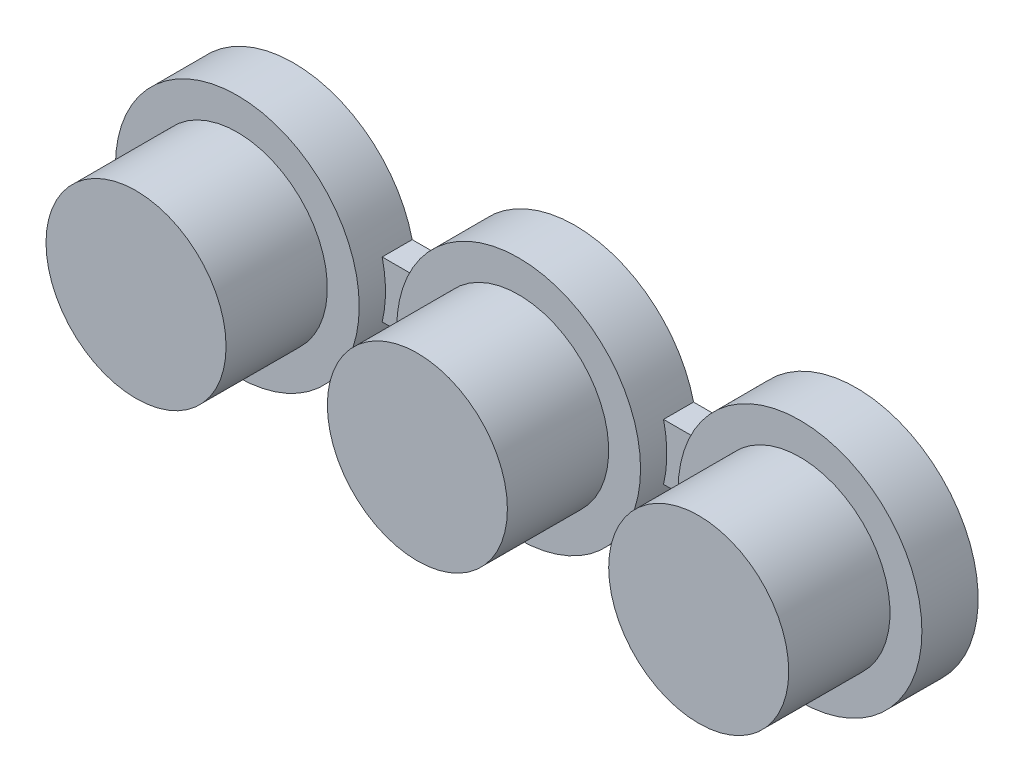
ISO-10303-21;
HEADER;
FILE_DESCRIPTION(('STEP AP214'),'2;1');
FILE_NAME('part.step','',(''),(''),'','','');
FILE_SCHEMA(('AUTOMOTIVE_DESIGN { 1 0 10303 214 1 1 1 1 }'));
ENDSEC;
DATA;
#1=APPLICATION_CONTEXT('core data for automotive mechanical design processes');
#2=APPLICATION_PROTOCOL_DEFINITION('international standard','automotive_design',2000,#1);
#3=PRODUCT_CONTEXT('',#1,'mechanical');
#4=PRODUCT('Part','Part','',(#3));
#5=PRODUCT_RELATED_PRODUCT_CATEGORY('part','',(#4));
#6=PRODUCT_DEFINITION_FORMATION('','',#4);
#7=PRODUCT_DEFINITION_CONTEXT('part definition',#1,'design');
#8=PRODUCT_DEFINITION('design','',#6,#7);
#9=PRODUCT_DEFINITION_SHAPE('','',#8);
#10=(LENGTH_UNIT() NAMED_UNIT(*) SI_UNIT(.MILLI.,.METRE.));
#11=(NAMED_UNIT(*) PLANE_ANGLE_UNIT() SI_UNIT($,.RADIAN.));
#12=(NAMED_UNIT(*) SI_UNIT($,.STERADIAN.) SOLID_ANGLE_UNIT());
#13=UNCERTAINTY_MEASURE_WITH_UNIT(LENGTH_MEASURE(1.E-05),#10,'distance_accuracy_value','');
#14=(GEOMETRIC_REPRESENTATION_CONTEXT(3) GLOBAL_UNCERTAINTY_ASSIGNED_CONTEXT((#13)) GLOBAL_UNIT_ASSIGNED_CONTEXT((#10,
#11,#12)) REPRESENTATION_CONTEXT('',''));
#15=CARTESIAN_POINT('',(0.,0.,0.));
#16=DIRECTION('',(0.,0.,1.));
#17=DIRECTION('',(1.,0.,0.));
#18=AXIS2_PLACEMENT_3D('',#15,#16,#17);
#19=CARTESIAN_POINT('',(-7.3315927665374,0.750000000000001,0.8));
#20=DIRECTION('',(0.,1.,0.));
#21=DIRECTION('',(-1.,0.,0.));
#22=AXIS2_PLACEMENT_3D('',#19,#20,#21);
#23=PLANE('',#22);
#24=DIRECTION('',(0.,0.,-1.));
#25=VECTOR('',#24,1.);
#26=CARTESIAN_POINT('',(4.33772233983162,0.749999999999999,1.5));
#27=LINE('',#26,#25);
#28=CARTESIAN_POINT('',(4.33772233983162,0.749999999999999,0.));
#29=VERTEX_POINT('',#28);
#30=CARTESIAN_POINT('',(4.33772233983162,0.749999999999999,0.8));
#31=VERTEX_POINT('',#30);
#32=EDGE_CURVE('E267',#29,#31,#27,.F.);
#33=ORIENTED_EDGE('',*,*,#32,.F.);
#34=DIRECTION('',(1.,0.,0.));
#35=VECTOR('',#34,1.);
#36=CARTESIAN_POINT('',(-7.3315927665374,0.750000000000001,0.));
#37=LINE('',#36,#35);
#38=CARTESIAN_POINT('',(3.16227766016838,0.749999999999999,0.));
#39=VERTEX_POINT('',#38);
#40=EDGE_CURVE('E143',#39,#29,#37,.T.);
#41=ORIENTED_EDGE('',*,*,#40,.F.);
#42=DIRECTION('',(0.,0.,-1.));
#43=VECTOR('',#42,1.);
#44=CARTESIAN_POINT('',(3.16227766016838,0.749999999999999,1.5));
#45=LINE('',#44,#43);
#46=CARTESIAN_POINT('',(3.16227766016838,0.749999999999999,0.8));
#47=VERTEX_POINT('',#46);
#48=EDGE_CURVE('E297',#47,#39,#45,.T.);
#49=ORIENTED_EDGE('',*,*,#48,.F.);
#50=DIRECTION('',(1.,0.,0.));
#51=VECTOR('',#50,1.);
#52=CARTESIAN_POINT('',(-7.3315927665374,0.750000000000001,0.8));
#53=LINE('',#52,#51);
#54=EDGE_CURVE('E309',#47,#31,#53,.T.);
#55=ORIENTED_EDGE('',*,*,#54,.T.);
#56=EDGE_LOOP('',(#33,#41,#49,#55));
#57=FACE_BOUND('',#56,.T.);
#58=ADVANCED_FACE('F45',(#57),#23,.T.);
#59=CARTESIAN_POINT('',(-7.3315927665374,-0.749999999999999,0.8));
#60=DIRECTION('',(0.,-1.,0.));
#61=DIRECTION('',(1.,0.,0.));
#62=AXIS2_PLACEMENT_3D('',#59,#60,#61);
#63=PLANE('',#62);
#64=DIRECTION('',(0.,0.,-1.));
#65=VECTOR('',#64,1.);
#66=CARTESIAN_POINT('',(4.33772233983162,-0.75,1.5));
#67=LINE('',#66,#65);
#68=CARTESIAN_POINT('',(4.33772233983162,-0.75,0.8));
#69=VERTEX_POINT('',#68);
#70=CARTESIAN_POINT('',(4.33772233983162,-0.75,0.));
#71=VERTEX_POINT('',#70);
#72=EDGE_CURVE('E61',#69,#71,#67,.T.);
#73=ORIENTED_EDGE('',*,*,#72,.F.);
#74=DIRECTION('',(-1.,0.,0.));
#75=VECTOR('',#74,1.);
#76=CARTESIAN_POINT('',(-7.3315927665374,-0.749999999999999,0.8));
#77=LINE('',#76,#75);
#78=CARTESIAN_POINT('',(3.16227766016838,-0.75,0.8));
#79=VERTEX_POINT('',#78);
#80=EDGE_CURVE('E148',#69,#79,#77,.T.);
#81=ORIENTED_EDGE('',*,*,#80,.T.);
#82=DIRECTION('',(0.,0.,-1.));
#83=VECTOR('',#82,1.);
#84=CARTESIAN_POINT('',(3.16227766016838,-0.75,1.5));
#85=LINE('',#84,#83);
#86=CARTESIAN_POINT('',(3.16227766016838,-0.75,0.));
#87=VERTEX_POINT('',#86);
#88=EDGE_CURVE('E293',#87,#79,#85,.F.);
#89=ORIENTED_EDGE('',*,*,#88,.F.);
#90=DIRECTION('',(-1.,0.,0.));
#91=VECTOR('',#90,1.);
#92=CARTESIAN_POINT('',(-7.3315927665374,-0.749999999999999,0.));
#93=LINE('',#92,#91);
#94=EDGE_CURVE('E150',#71,#87,#93,.T.);
#95=ORIENTED_EDGE('',*,*,#94,.F.);
#96=EDGE_LOOP('',(#73,#81,#89,#95));
#97=FACE_BOUND('',#96,.T.);
#98=ADVANCED_FACE('F190',(#97),#63,.T.);
#99=DIRECTION('',(0.,0.,-1.));
#100=VECTOR('',#99,1.);
#101=CARTESIAN_POINT('',(-4.33772233983162,0.75,1.5));
#102=LINE('',#101,#100);
#103=CARTESIAN_POINT('',(-4.33772233983162,0.75,0.8));
#104=VERTEX_POINT('',#103);
#105=CARTESIAN_POINT('',(-4.33772233983162,0.75,0.));
#106=VERTEX_POINT('',#105);
#107=EDGE_CURVE('E111',#104,#106,#102,.T.);
#108=ORIENTED_EDGE('',*,*,#107,.F.);
#109=CARTESIAN_POINT('',(-3.16227766016838,0.75,0.8));
#110=VERTEX_POINT('',#109);
#111=EDGE_CURVE('E159',#104,#110,#53,.T.);
#112=ORIENTED_EDGE('',*,*,#111,.T.);
#113=DIRECTION('',(0.,0.,-1.));
#114=VECTOR('',#113,1.);
#115=CARTESIAN_POINT('',(-3.16227766016838,0.75,1.5));
#116=LINE('',#115,#114);
#117=CARTESIAN_POINT('',(-3.16227766016838,0.75,0.));
#118=VERTEX_POINT('',#117);
#119=EDGE_CURVE('E139',#118,#110,#116,.F.);
#120=ORIENTED_EDGE('',*,*,#119,.F.);
#121=EDGE_CURVE('E130',#106,#118,#37,.T.);
#122=ORIENTED_EDGE('',*,*,#121,.F.);
#123=EDGE_LOOP('',(#108,#112,#120,#122));
#124=FACE_BOUND('',#123,.T.);
#125=ADVANCED_FACE('F137',(#124),#23,.T.);
#126=DIRECTION('',(0.,0.,-1.));
#127=VECTOR('',#126,1.);
#128=CARTESIAN_POINT('',(-4.33772233983162,-0.749999999999999,1.5));
#129=LINE('',#128,#127);
#130=CARTESIAN_POINT('',(-4.33772233983162,-0.749999999999999,0.));
#131=VERTEX_POINT('',#130);
#132=CARTESIAN_POINT('',(-4.33772233983162,-0.749999999999999,0.8));
#133=VERTEX_POINT('',#132);
#134=EDGE_CURVE('E123',#131,#133,#129,.F.);
#135=ORIENTED_EDGE('',*,*,#134,.F.);
#136=CARTESIAN_POINT('',(-3.16227766016838,-0.749999999999999,0.));
#137=VERTEX_POINT('',#136);
#138=EDGE_CURVE('E133',#137,#131,#93,.T.);
#139=ORIENTED_EDGE('',*,*,#138,.F.);
#140=DIRECTION('',(0.,0.,-1.));
#141=VECTOR('',#140,1.);
#142=CARTESIAN_POINT('',(-3.16227766016838,-0.749999999999999,1.5));
#143=LINE('',#142,#141);
#144=CARTESIAN_POINT('',(-3.16227766016838,-0.749999999999999,0.8));
#145=VERTEX_POINT('',#144);
#146=EDGE_CURVE('E280',#145,#137,#143,.T.);
#147=ORIENTED_EDGE('',*,*,#146,.F.);
#148=EDGE_CURVE('E142',#145,#133,#77,.T.);
#149=ORIENTED_EDGE('',*,*,#148,.T.);
#150=EDGE_LOOP('',(#135,#139,#147,#149));
#151=FACE_BOUND('',#150,.T.);
#152=ADVANCED_FACE('F197',(#151),#63,.T.);
#153=CARTESIAN_POINT('',(0.,0.,0.8));
#154=DIRECTION('',(0.,0.,-1.));
#155=DIRECTION('',(-1.,0.,0.));
#156=AXIS2_PLACEMENT_3D('',#153,#154,#155);
#157=PLANE('',#156);
#158=ORIENTED_EDGE('',*,*,#80,.F.);
#159=CARTESIAN_POINT('',(7.5,0.,0.8));
#160=DIRECTION('',(0.,0.,-1.));
#161=DIRECTION('',(-1.,0.,0.));
#162=AXIS2_PLACEMENT_3D('',#159,#160,#161);
#163=CIRCLE('',#162,3.25);
#164=EDGE_CURVE('E68',#69,#31,#163,.T.);
#165=ORIENTED_EDGE('',*,*,#164,.T.);
#166=ORIENTED_EDGE('',*,*,#54,.F.);
#167=CARTESIAN_POINT('',(0.,0.,0.8));
#168=DIRECTION('',(0.,0.,-1.));
#169=DIRECTION('',(-1.,0.,0.));
#170=AXIS2_PLACEMENT_3D('',#167,#168,#169);
#171=CIRCLE('',#170,3.25);
#172=EDGE_CURVE('E289',#47,#79,#171,.T.);
#173=ORIENTED_EDGE('',*,*,#172,.T.);
#174=EDGE_LOOP('',(#158,#165,#166,#173));
#175=FACE_BOUND('',#174,.T.);
#176=ADVANCED_FACE('F203',(#175),#157,.F.);
#177=CARTESIAN_POINT('',(-7.5,0.,0.));
#178=DIRECTION('',(0.,0.,1.));
#179=DIRECTION('',(1.,0.,0.));
#180=AXIS2_PLACEMENT_3D('',#177,#178,#179);
#181=PLANE('',#180);
#182=ORIENTED_EDGE('',*,*,#40,.T.);
#183=CARTESIAN_POINT('',(7.5,0.,0.));
#184=DIRECTION('',(0.,0.,-1.));
#185=DIRECTION('',(-1.,0.,0.));
#186=AXIS2_PLACEMENT_3D('',#183,#184,#185);
#187=CIRCLE('',#186,3.25);
#188=EDGE_CURVE('E257',#29,#71,#187,.T.);
#189=ORIENTED_EDGE('',*,*,#188,.T.);
#190=ORIENTED_EDGE('',*,*,#94,.T.);
#191=CARTESIAN_POINT('',(0.,0.,0.));
#192=DIRECTION('',(0.,0.,-1.));
#193=DIRECTION('',(-1.,0.,0.));
#194=AXIS2_PLACEMENT_3D('',#191,#192,#193);
#195=CIRCLE('',#194,3.25);
#196=EDGE_CURVE('E122',#87,#137,#195,.T.);
#197=ORIENTED_EDGE('',*,*,#196,.T.);
#198=ORIENTED_EDGE('',*,*,#138,.T.);
#199=CARTESIAN_POINT('',(-7.5,0.,0.));
#200=DIRECTION('',(0.,0.,-1.));
#201=DIRECTION('',(-1.,0.,0.));
#202=AXIS2_PLACEMENT_3D('',#199,#200,#201);
#203=CIRCLE('',#202,3.25);
#204=EDGE_CURVE('E114',#131,#106,#203,.T.);
#205=ORIENTED_EDGE('',*,*,#204,.T.);
#206=ORIENTED_EDGE('',*,*,#121,.T.);
#207=EDGE_CURVE('E281',#118,#39,#195,.T.);
#208=ORIENTED_EDGE('',*,*,#207,.T.);
#209=EDGE_LOOP('',(#182,#189,#190,#197,#198,#205,#206,#208));
#210=FACE_BOUND('',#209,.T.);
#211=ADVANCED_FACE('F128',(#210),#181,.F.);
#212=ORIENTED_EDGE('',*,*,#111,.F.);
#213=CARTESIAN_POINT('',(-7.5,0.,0.8));
#214=DIRECTION('',(0.,0.,-1.));
#215=DIRECTION('',(-1.,0.,0.));
#216=AXIS2_PLACEMENT_3D('',#213,#214,#215);
#217=CIRCLE('',#216,3.25);
#218=EDGE_CURVE('E117',#104,#133,#217,.T.);
#219=ORIENTED_EDGE('',*,*,#218,.T.);
#220=ORIENTED_EDGE('',*,*,#148,.F.);
#221=CARTESIAN_POINT('',(0.,0.,0.8));
#222=DIRECTION('',(0.,0.,-1.));
#223=DIRECTION('',(-1.,0.,0.));
#224=AXIS2_PLACEMENT_3D('',#221,#222,#223);
#225=CIRCLE('',#224,3.25);
#226=EDGE_CURVE('E163',#145,#110,#225,.T.);
#227=ORIENTED_EDGE('',*,*,#226,.T.);
#228=EDGE_LOOP('',(#212,#219,#220,#227));
#229=FACE_BOUND('',#228,.T.);
#230=ADVANCED_FACE('F208',(#229),#157,.F.);
#231=CARTESIAN_POINT('',(0.,0.,1.5));
#232=DIRECTION('',(0.,0.,-1.));
#233=DIRECTION('',(-1.,0.,0.));
#234=AXIS2_PLACEMENT_3D('',#231,#232,#233);
#235=CYLINDRICAL_SURFACE('',#234,3.25);
#236=ORIENTED_EDGE('',*,*,#172,.F.);
#237=ORIENTED_EDGE('',*,*,#48,.T.);
#238=ORIENTED_EDGE('',*,*,#207,.F.);
#239=ORIENTED_EDGE('',*,*,#119,.T.);
#240=ORIENTED_EDGE('',*,*,#226,.F.);
#241=ORIENTED_EDGE('',*,*,#146,.T.);
#242=ORIENTED_EDGE('',*,*,#196,.F.);
#243=ORIENTED_EDGE('',*,*,#88,.T.);
#244=EDGE_LOOP('',(#236,#237,#238,#239,#240,#241,#242,#243));
#245=FACE_BOUND('',#244,.T.);
#246=CARTESIAN_POINT('',(0.,0.,1.5));
#247=DIRECTION('',(0.,0.,-1.));
#248=DIRECTION('',(-1.,0.,0.));
#249=AXIS2_PLACEMENT_3D('',#246,#247,#248);
#250=CIRCLE('',#249,3.25);
#251=CARTESIAN_POINT('',(-3.25,0.,1.5));
#252=VERTEX_POINT('',#251);
#253=EDGE_CURVE('E276',#252,#252,#250,.T.);
#254=ORIENTED_EDGE('',*,*,#253,.T.);
#255=EDGE_LOOP('',(#254));
#256=FACE_BOUND('',#255,.T.);
#257=ADVANCED_FACE('F213',(#245,#256),#235,.T.);
#258=CARTESIAN_POINT('',(0.,0.,1.5));
#259=DIRECTION('',(0.,0.,-1.));
#260=DIRECTION('',(-1.,0.,0.));
#261=AXIS2_PLACEMENT_3D('',#258,#259,#260);
#262=PLANE('',#261);
#263=CARTESIAN_POINT('',(0.,0.,1.5));
#264=DIRECTION('',(0.,0.,-1.));
#265=DIRECTION('',(-1.,0.,0.));
#266=AXIS2_PLACEMENT_3D('',#263,#264,#265);
#267=CIRCLE('',#266,2.4);
#268=CARTESIAN_POINT('',(-2.4,0.,1.5));
#269=VERTEX_POINT('',#268);
#270=EDGE_CURVE('E158',#269,#269,#267,.T.);
#271=ORIENTED_EDGE('',*,*,#270,.T.);
#272=EDGE_LOOP('',(#271));
#273=FACE_BOUND('',#272,.T.);
#274=ORIENTED_EDGE('',*,*,#253,.F.);
#275=EDGE_LOOP('',(#274));
#276=FACE_BOUND('',#275,.T.);
#277=ADVANCED_FACE('F218',(#273,#276),#262,.F.);
#278=CARTESIAN_POINT('',(0.,0.,4.2));
#279=DIRECTION('',(0.,0.,1.));
#280=DIRECTION('',(1.,0.,0.));
#281=AXIS2_PLACEMENT_3D('',#278,#279,#280);
#282=PLANE('',#281);
#283=CARTESIAN_POINT('',(0.,0.,4.2));
#284=DIRECTION('',(0.,0.,1.));
#285=DIRECTION('',(1.,0.,0.));
#286=AXIS2_PLACEMENT_3D('',#283,#284,#285);
#287=CIRCLE('',#286,2.4);
#288=CARTESIAN_POINT('',(2.4,0.,4.2));
#289=VERTEX_POINT('',#288);
#290=EDGE_CURVE('E305',#289,#289,#287,.T.);
#291=ORIENTED_EDGE('',*,*,#290,.T.);
#292=EDGE_LOOP('',(#291));
#293=FACE_BOUND('',#292,.T.);
#294=ADVANCED_FACE('F222',(#293),#282,.T.);
#295=CARTESIAN_POINT('',(0.,0.,4.2));
#296=DIRECTION('',(0.,0.,-1.));
#297=DIRECTION('',(-1.,0.,0.));
#298=AXIS2_PLACEMENT_3D('',#295,#296,#297);
#299=CYLINDRICAL_SURFACE('',#298,2.4);
#300=ORIENTED_EDGE('',*,*,#290,.F.);
#301=EDGE_LOOP('',(#300));
#302=FACE_BOUND('',#301,.T.);
#303=ORIENTED_EDGE('',*,*,#270,.F.);
#304=EDGE_LOOP('',(#303));
#305=FACE_BOUND('',#304,.T.);
#306=ADVANCED_FACE('F225',(#302,#305),#299,.T.);
#307=CARTESIAN_POINT('',(-7.5,0.,1.5));
#308=DIRECTION('',(0.,0.,-1.));
#309=DIRECTION('',(-1.,0.,0.));
#310=AXIS2_PLACEMENT_3D('',#307,#308,#309);
#311=CYLINDRICAL_SURFACE('',#310,3.25);
#312=CARTESIAN_POINT('',(-7.5,0.,1.5));
#313=DIRECTION('',(0.,0.,-1.));
#314=DIRECTION('',(-1.,0.,0.));
#315=AXIS2_PLACEMENT_3D('',#312,#313,#314);
#316=CIRCLE('',#315,3.25);
#317=CARTESIAN_POINT('',(-10.75,0.,1.5));
#318=VERTEX_POINT('',#317);
#319=EDGE_CURVE('E135',#318,#318,#316,.T.);
#320=ORIENTED_EDGE('',*,*,#319,.T.);
#321=EDGE_LOOP('',(#320));
#322=FACE_BOUND('',#321,.T.);
#323=ORIENTED_EDGE('',*,*,#218,.F.);
#324=ORIENTED_EDGE('',*,*,#107,.T.);
#325=ORIENTED_EDGE('',*,*,#204,.F.);
#326=ORIENTED_EDGE('',*,*,#134,.T.);
#327=EDGE_LOOP('',(#323,#324,#325,#326));
#328=FACE_BOUND('',#327,.T.);
#329=ADVANCED_FACE('F113',(#322,#328),#311,.T.);
#330=CARTESIAN_POINT('',(-7.5,0.,1.5));
#331=DIRECTION('',(0.,0.,-1.));
#332=DIRECTION('',(-1.,0.,0.));
#333=AXIS2_PLACEMENT_3D('',#330,#331,#332);
#334=PLANE('',#333);
#335=CARTESIAN_POINT('',(-7.5,0.,1.5));
#336=DIRECTION('',(0.,0.,-1.));
#337=DIRECTION('',(-1.,0.,0.));
#338=AXIS2_PLACEMENT_3D('',#335,#336,#337);
#339=CIRCLE('',#338,2.4);
#340=CARTESIAN_POINT('',(-9.9,0.,1.5));
#341=VERTEX_POINT('',#340);
#342=EDGE_CURVE('E54',#341,#341,#339,.T.);
#343=ORIENTED_EDGE('',*,*,#342,.T.);
#344=EDGE_LOOP('',(#343));
#345=FACE_BOUND('',#344,.T.);
#346=ORIENTED_EDGE('',*,*,#319,.F.);
#347=EDGE_LOOP('',(#346));
#348=FACE_BOUND('',#347,.T.);
#349=ADVANCED_FACE('F172',(#345,#348),#334,.F.);
#350=CARTESIAN_POINT('',(-7.5,0.,4.2));
#351=DIRECTION('',(0.,0.,1.));
#352=DIRECTION('',(1.,0.,0.));
#353=AXIS2_PLACEMENT_3D('',#350,#351,#352);
#354=PLANE('',#353);
#355=CARTESIAN_POINT('',(-7.5,0.,4.2));
#356=DIRECTION('',(0.,0.,1.));
#357=DIRECTION('',(1.,0.,0.));
#358=AXIS2_PLACEMENT_3D('',#355,#356,#357);
#359=CIRCLE('',#358,2.4);
#360=CARTESIAN_POINT('',(-5.1,0.,4.2));
#361=VERTEX_POINT('',#360);
#362=EDGE_CURVE('E154',#361,#361,#359,.T.);
#363=ORIENTED_EDGE('',*,*,#362,.T.);
#364=EDGE_LOOP('',(#363));
#365=FACE_BOUND('',#364,.T.);
#366=ADVANCED_FACE('F177',(#365),#354,.T.);
#367=CARTESIAN_POINT('',(-7.5,0.,4.2));
#368=DIRECTION('',(0.,0.,-1.));
#369=DIRECTION('',(-1.,0.,0.));
#370=AXIS2_PLACEMENT_3D('',#367,#368,#369);
#371=CYLINDRICAL_SURFACE('',#370,2.4);
#372=ORIENTED_EDGE('',*,*,#362,.F.);
#373=EDGE_LOOP('',(#372));
#374=FACE_BOUND('',#373,.T.);
#375=ORIENTED_EDGE('',*,*,#342,.F.);
#376=EDGE_LOOP('',(#375));
#377=FACE_BOUND('',#376,.T.);
#378=ADVANCED_FACE('F47',(#374,#377),#371,.T.);
#379=CARTESIAN_POINT('',(7.5,0.,1.5));
#380=DIRECTION('',(0.,0.,-1.));
#381=DIRECTION('',(-1.,0.,0.));
#382=AXIS2_PLACEMENT_3D('',#379,#380,#381);
#383=CYLINDRICAL_SURFACE('',#382,3.25);
#384=ORIENTED_EDGE('',*,*,#188,.F.);
#385=ORIENTED_EDGE('',*,*,#32,.T.);
#386=ORIENTED_EDGE('',*,*,#164,.F.);
#387=ORIENTED_EDGE('',*,*,#72,.T.);
#388=EDGE_LOOP('',(#384,#385,#386,#387));
#389=FACE_BOUND('',#388,.T.);
#390=CARTESIAN_POINT('',(7.5,0.,1.5));
#391=DIRECTION('',(0.,0.,-1.));
#392=DIRECTION('',(-1.,0.,0.));
#393=AXIS2_PLACEMENT_3D('',#390,#391,#392);
#394=CIRCLE('',#393,3.25);
#395=CARTESIAN_POINT('',(4.25,0.,1.5));
#396=VERTEX_POINT('',#395);
#397=EDGE_CURVE('E254',#396,#396,#394,.T.);
#398=ORIENTED_EDGE('',*,*,#397,.T.);
#399=EDGE_LOOP('',(#398));
#400=FACE_BOUND('',#399,.T.);
#401=ADVANCED_FACE('F176',(#389,#400),#383,.T.);
#402=CARTESIAN_POINT('',(7.5,0.,1.5));
#403=DIRECTION('',(0.,0.,-1.));
#404=DIRECTION('',(-1.,0.,0.));
#405=AXIS2_PLACEMENT_3D('',#402,#403,#404);
#406=PLANE('',#405);
#407=CARTESIAN_POINT('',(7.5,0.,1.5));
#408=DIRECTION('',(0.,0.,-1.));
#409=DIRECTION('',(-1.,0.,0.));
#410=AXIS2_PLACEMENT_3D('',#407,#408,#409);
#411=CIRCLE('',#410,2.4);
#412=CARTESIAN_POINT('',(5.1,0.,1.5));
#413=VERTEX_POINT('',#412);
#414=EDGE_CURVE('E11',#413,#413,#411,.T.);
#415=ORIENTED_EDGE('',*,*,#414,.T.);
#416=EDGE_LOOP('',(#415));
#417=FACE_BOUND('',#416,.T.);
#418=ORIENTED_EDGE('',*,*,#397,.F.);
#419=EDGE_LOOP('',(#418));
#420=FACE_BOUND('',#419,.T.);
#421=ADVANCED_FACE('F183',(#417,#420),#406,.F.);
#422=CARTESIAN_POINT('',(7.5,0.,4.2));
#423=DIRECTION('',(0.,0.,1.));
#424=DIRECTION('',(1.,0.,0.));
#425=AXIS2_PLACEMENT_3D('',#422,#423,#424);
#426=PLANE('',#425);
#427=CARTESIAN_POINT('',(7.5,0.,4.2));
#428=DIRECTION('',(0.,0.,1.));
#429=DIRECTION('',(1.,0.,0.));
#430=AXIS2_PLACEMENT_3D('',#427,#428,#429);
#431=CIRCLE('',#430,2.4);
#432=CARTESIAN_POINT('',(9.9,0.,4.2));
#433=VERTEX_POINT('',#432);
#434=EDGE_CURVE('E301',#433,#433,#431,.T.);
#435=ORIENTED_EDGE('',*,*,#434,.T.);
#436=EDGE_LOOP('',(#435));
#437=FACE_BOUND('',#436,.T.);
#438=ADVANCED_FACE('F230',(#437),#426,.T.);
#439=CARTESIAN_POINT('',(7.5,0.,4.2));
#440=DIRECTION('',(0.,0.,-1.));
#441=DIRECTION('',(-1.,0.,0.));
#442=AXIS2_PLACEMENT_3D('',#439,#440,#441);
#443=CYLINDRICAL_SURFACE('',#442,2.4);
#444=ORIENTED_EDGE('',*,*,#434,.F.);
#445=EDGE_LOOP('',(#444));
#446=FACE_BOUND('',#445,.T.);
#447=ORIENTED_EDGE('',*,*,#414,.F.);
#448=EDGE_LOOP('',(#447));
#449=FACE_BOUND('',#448,.T.);
#450=ADVANCED_FACE('F233',(#446,#449),#443,.T.);
#451=CLOSED_SHELL('',(#58,#98,#125,#152,#176,#211,#230,#257,#277,#294,#306,#329,#349,#366,#378,
#401,#421,#438,#450));
#452=MANIFOLD_SOLID_BREP('B2',#451);
#453=ADVANCED_BREP_SHAPE_REPRESENTATION('',(#18,#452),#14);
#454=SHAPE_DEFINITION_REPRESENTATION(#9,#453);
ENDSEC;
END-ISO-10303-21;
